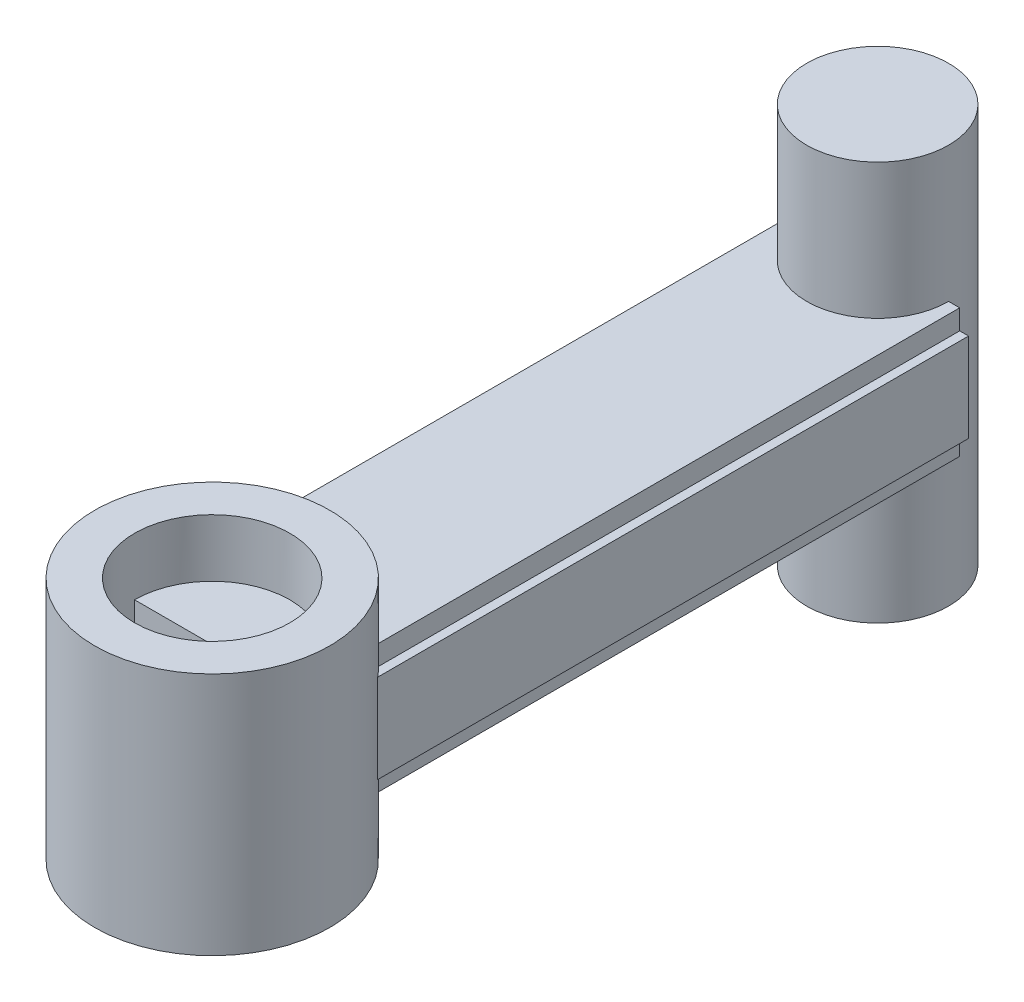
ISO-10303-21;
HEADER;
FILE_DESCRIPTION(('STEP AP214'),'2;1');
FILE_NAME('part.step','',(''),(''),'','','');
FILE_SCHEMA(('AUTOMOTIVE_DESIGN { 1 0 10303 214 1 1 1 1 }'));
ENDSEC;
DATA;
#1=APPLICATION_CONTEXT('core data for automotive mechanical design processes');
#2=APPLICATION_PROTOCOL_DEFINITION('international standard','automotive_design',2000,#1);
#3=PRODUCT_CONTEXT('',#1,'mechanical');
#4=PRODUCT('Part','Part','',(#3));
#5=PRODUCT_RELATED_PRODUCT_CATEGORY('part','',(#4));
#6=PRODUCT_DEFINITION_FORMATION('','',#4);
#7=PRODUCT_DEFINITION_CONTEXT('part definition',#1,'design');
#8=PRODUCT_DEFINITION('design','',#6,#7);
#9=PRODUCT_DEFINITION_SHAPE('','',#8);
#10=(LENGTH_UNIT() NAMED_UNIT(*) SI_UNIT(.MILLI.,.METRE.));
#11=(NAMED_UNIT(*) PLANE_ANGLE_UNIT() SI_UNIT($,.RADIAN.));
#12=(NAMED_UNIT(*) SI_UNIT($,.STERADIAN.) SOLID_ANGLE_UNIT());
#13=UNCERTAINTY_MEASURE_WITH_UNIT(LENGTH_MEASURE(1.E-05),#10,'distance_accuracy_value','');
#14=(GEOMETRIC_REPRESENTATION_CONTEXT(3) GLOBAL_UNCERTAINTY_ASSIGNED_CONTEXT((#13)) GLOBAL_UNIT_ASSIGNED_CONTEXT((#10,
#11,#12)) REPRESENTATION_CONTEXT('',''));
#15=CARTESIAN_POINT('',(0.,0.,0.));
#16=DIRECTION('',(0.,0.,1.));
#17=DIRECTION('',(1.,0.,0.));
#18=AXIS2_PLACEMENT_3D('',#15,#16,#17);
#19=CARTESIAN_POINT('',(-37.,-29.,300.));
#20=DIRECTION('',(1.,0.,0.));
#21=DIRECTION('',(0.,0.,-1.));
#22=AXIS2_PLACEMENT_3D('',#19,#20,#21);
#23=PLANE('',#22);
#24=DIRECTION('',(0.,0.,-1.));
#25=VECTOR('',#24,1.);
#26=CARTESIAN_POINT('',(-37.,20.,300.));
#27=LINE('',#26,#25);
#28=CARTESIAN_POINT('',(-37.,20.,262.052668077979));
#29=VERTEX_POINT('',#28);
#30=CARTESIAN_POINT('',(-37.,20.,0.));
#31=VERTEX_POINT('',#30);
#32=EDGE_CURVE('E377',#29,#31,#27,.T.);
#33=ORIENTED_EDGE('',*,*,#32,.F.);
#34=DIRECTION('',(0.,1.,0.));
#35=VECTOR('',#34,1.);
#36=CARTESIAN_POINT('',(-37.,-55.,262.052668077979));
#37=LINE('',#36,#35);
#38=CARTESIAN_POINT('',(-37.,29.,262.052668077979));
#39=VERTEX_POINT('',#38);
#40=EDGE_CURVE('E171',#29,#39,#37,.T.);
#41=ORIENTED_EDGE('',*,*,#40,.T.);
#42=DIRECTION('',(0.,0.,-1.));
#43=VECTOR('',#42,1.);
#44=CARTESIAN_POINT('',(-37.,29.,300.));
#45=LINE('',#44,#43);
#46=CARTESIAN_POINT('',(-37.,29.,0.));
#47=VERTEX_POINT('',#46);
#48=EDGE_CURVE('E231',#39,#47,#45,.T.);
#49=ORIENTED_EDGE('',*,*,#48,.T.);
#50=DIRECTION('',(0.,-1.,0.));
#51=VECTOR('',#50,1.);
#52=CARTESIAN_POINT('',(-37.,-29.,0.));
#53=LINE('',#52,#51);
#54=EDGE_CURVE('E223',#47,#31,#53,.T.);
#55=ORIENTED_EDGE('',*,*,#54,.T.);
#56=EDGE_LOOP('',(#33,#41,#49,#55));
#57=FACE_BOUND('',#56,.T.);
#58=ADVANCED_FACE('F41',(#57),#23,.F.);
#59=CARTESIAN_POINT('',(37.,-29.,300.));
#60=DIRECTION('',(-1.,0.,0.));
#61=DIRECTION('',(0.,0.,1.));
#62=AXIS2_PLACEMENT_3D('',#59,#60,#61);
#63=PLANE('',#62);
#64=DIRECTION('',(0.,0.,-1.));
#65=VECTOR('',#64,1.);
#66=CARTESIAN_POINT('',(37.,-20.,300.));
#67=LINE('',#66,#65);
#68=CARTESIAN_POINT('',(37.,-20.,262.052668077979));
#69=VERTEX_POINT('',#68);
#70=CARTESIAN_POINT('',(37.,-20.,0.));
#71=VERTEX_POINT('',#70);
#72=EDGE_CURVE('E202',#69,#71,#67,.T.);
#73=ORIENTED_EDGE('',*,*,#72,.F.);
#74=DIRECTION('',(0.,1.,0.));
#75=VECTOR('',#74,1.);
#76=CARTESIAN_POINT('',(37.,-55.,262.052668077979));
#77=LINE('',#76,#75);
#78=CARTESIAN_POINT('',(37.,-29.,262.052668077979));
#79=VERTEX_POINT('',#78);
#80=EDGE_CURVE('E363',#69,#79,#77,.F.);
#81=ORIENTED_EDGE('',*,*,#80,.T.);
#82=DIRECTION('',(0.,0.,-1.));
#83=VECTOR('',#82,1.);
#84=CARTESIAN_POINT('',(37.,-29.,300.));
#85=LINE('',#84,#83);
#86=CARTESIAN_POINT('',(37.,-29.,0.));
#87=VERTEX_POINT('',#86);
#88=EDGE_CURVE('E214',#79,#87,#85,.T.);
#89=ORIENTED_EDGE('',*,*,#88,.T.);
#90=DIRECTION('',(0.,1.,0.));
#91=VECTOR('',#90,1.);
#92=CARTESIAN_POINT('',(37.,-29.,0.));
#93=LINE('',#92,#91);
#94=EDGE_CURVE('E215',#87,#71,#93,.T.);
#95=ORIENTED_EDGE('',*,*,#94,.T.);
#96=EDGE_LOOP('',(#73,#81,#89,#95));
#97=FACE_BOUND('',#96,.T.);
#98=ADVANCED_FACE('F273',(#97),#63,.F.);
#99=CARTESIAN_POINT('',(0.,-90.,0.));
#100=DIRECTION('',(0.,1.,0.));
#101=DIRECTION('',(0.,0.,1.));
#102=AXIS2_PLACEMENT_3D('',#99,#100,#101);
#103=CYLINDRICAL_SURFACE('',#102,32.);
#104=DIRECTION('',(0.,1.,0.));
#105=VECTOR('',#104,1.);
#106=CARTESIAN_POINT('',(-32.,-90.,0.));
#107=LINE('',#106,#105);
#108=CARTESIAN_POINT('',(-32.,29.,0.));
#109=VERTEX_POINT('',#108);
#110=CARTESIAN_POINT('',(-32.,-29.,0.));
#111=VERTEX_POINT('',#110);
#112=EDGE_CURVE('E162',#109,#111,#107,.F.);
#113=ORIENTED_EDGE('',*,*,#112,.F.);
#114=CARTESIAN_POINT('',(0.,29.,0.));
#115=DIRECTION('',(0.,-1.,0.));
#116=DIRECTION('',(0.,0.,-1.));
#117=AXIS2_PLACEMENT_3D('',#114,#115,#116);
#118=CIRCLE('',#117,32.);
#119=CARTESIAN_POINT('',(32.,29.,0.));
#120=VERTEX_POINT('',#119);
#121=EDGE_CURVE('E246',#109,#120,#118,.F.);
#122=ORIENTED_EDGE('',*,*,#121,.T.);
#123=DIRECTION('',(0.,1.,0.));
#124=VECTOR('',#123,1.);
#125=CARTESIAN_POINT('',(32.,-90.,0.));
#126=LINE('',#125,#124);
#127=CARTESIAN_POINT('',(32.,-29.,0.));
#128=VERTEX_POINT('',#127);
#129=EDGE_CURVE('E241',#128,#120,#126,.T.);
#130=ORIENTED_EDGE('',*,*,#129,.F.);
#131=CARTESIAN_POINT('',(0.,-29.,0.));
#132=DIRECTION('',(0.,1.,0.));
#133=DIRECTION('',(0.,0.,1.));
#134=AXIS2_PLACEMENT_3D('',#131,#132,#133);
#135=CIRCLE('',#134,32.);
#136=EDGE_CURVE('E244',#128,#111,#135,.F.);
#137=ORIENTED_EDGE('',*,*,#136,.T.);
#138=EDGE_LOOP('',(#113,#122,#130,#137));
#139=FACE_BOUND('',#138,.T.);
#140=CARTESIAN_POINT('',(0.,-90.,0.));
#141=DIRECTION('',(0.,1.,0.));
#142=DIRECTION('',(0.,0.,1.));
#143=AXIS2_PLACEMENT_3D('',#140,#141,#142);
#144=CIRCLE('',#143,32.);
#145=CARTESIAN_POINT('',(0.,-90.,32.));
#146=VERTEX_POINT('',#145);
#147=EDGE_CURVE('E238',#146,#146,#144,.T.);
#148=ORIENTED_EDGE('',*,*,#147,.T.);
#149=EDGE_LOOP('',(#148));
#150=FACE_BOUND('',#149,.T.);
#151=CARTESIAN_POINT('',(0.,90.,0.));
#152=DIRECTION('',(0.,1.,0.));
#153=DIRECTION('',(0.,0.,1.));
#154=AXIS2_PLACEMENT_3D('',#151,#152,#153);
#155=CIRCLE('',#154,32.);
#156=CARTESIAN_POINT('',(0.,90.,32.));
#157=VERTEX_POINT('',#156);
#158=EDGE_CURVE('E235',#157,#157,#155,.T.);
#159=ORIENTED_EDGE('',*,*,#158,.F.);
#160=EDGE_LOOP('',(#159));
#161=FACE_BOUND('',#160,.T.);
#162=ADVANCED_FACE('F43',(#139,#150,#161),#103,.T.);
#163=CARTESIAN_POINT('',(0.,-90.,0.));
#164=DIRECTION('',(0.,1.,0.));
#165=DIRECTION('',(0.,0.,1.));
#166=AXIS2_PLACEMENT_3D('',#163,#164,#165);
#167=PLANE('',#166);
#168=ORIENTED_EDGE('',*,*,#147,.F.);
#169=EDGE_LOOP('',(#168));
#170=FACE_BOUND('',#169,.T.);
#171=ADVANCED_FACE('F407',(#170),#167,.F.);
#172=CARTESIAN_POINT('',(0.,90.,0.));
#173=DIRECTION('',(0.,1.,0.));
#174=DIRECTION('',(0.,0.,1.));
#175=AXIS2_PLACEMENT_3D('',#172,#173,#174);
#176=PLANE('',#175);
#177=ORIENTED_EDGE('',*,*,#158,.T.);
#178=EDGE_LOOP('',(#177));
#179=FACE_BOUND('',#178,.T.);
#180=ADVANCED_FACE('F412',(#179),#176,.T.);
#181=CARTESIAN_POINT('',(0.,0.,0.));
#182=DIRECTION('',(0.,0.,-1.));
#183=DIRECTION('',(-1.,0.,0.));
#184=AXIS2_PLACEMENT_3D('',#181,#182,#183);
#185=PLANE('',#184);
#186=DIRECTION('',(-1.,0.,0.));
#187=VECTOR('',#186,1.);
#188=CARTESIAN_POINT('',(-37.,29.,0.));
#189=LINE('',#188,#187);
#190=EDGE_CURVE('E218',#109,#47,#189,.T.);
#191=ORIENTED_EDGE('',*,*,#190,.F.);
#192=ORIENTED_EDGE('',*,*,#112,.T.);
#193=DIRECTION('',(1.,0.,0.));
#194=VECTOR('',#193,1.);
#195=CARTESIAN_POINT('',(-37.,-29.,0.));
#196=LINE('',#195,#194);
#197=CARTESIAN_POINT('',(-37.,-29.,0.));
#198=VERTEX_POINT('',#197);
#199=EDGE_CURVE('E212',#198,#111,#196,.T.);
#200=ORIENTED_EDGE('',*,*,#199,.F.);
#201=CARTESIAN_POINT('',(-37.,-20.,0.));
#202=VERTEX_POINT('',#201);
#203=EDGE_CURVE('E222',#202,#198,#53,.T.);
#204=ORIENTED_EDGE('',*,*,#203,.F.);
#205=DIRECTION('',(1.,0.,0.));
#206=VECTOR('',#205,1.);
#207=CARTESIAN_POINT('',(-41.,-20.,0.));
#208=LINE('',#207,#206);
#209=CARTESIAN_POINT('',(-41.,-20.,0.));
#210=VERTEX_POINT('',#209);
#211=EDGE_CURVE('E176',#210,#202,#208,.T.);
#212=ORIENTED_EDGE('',*,*,#211,.F.);
#213=DIRECTION('',(0.,-1.,0.));
#214=VECTOR('',#213,1.);
#215=CARTESIAN_POINT('',(-41.,-20.,0.));
#216=LINE('',#215,#214);
#217=CARTESIAN_POINT('',(-41.,20.,0.));
#218=VERTEX_POINT('',#217);
#219=EDGE_CURVE('E180',#218,#210,#216,.T.);
#220=ORIENTED_EDGE('',*,*,#219,.F.);
#221=DIRECTION('',(-1.,0.,0.));
#222=VECTOR('',#221,1.);
#223=CARTESIAN_POINT('',(-41.,20.,0.));
#224=LINE('',#223,#222);
#225=EDGE_CURVE('E188',#31,#218,#224,.T.);
#226=ORIENTED_EDGE('',*,*,#225,.F.);
#227=ORIENTED_EDGE('',*,*,#54,.F.);
#228=EDGE_LOOP('',(#191,#192,#200,#204,#212,#220,#226,#227));
#229=FACE_BOUND('',#228,.T.);
#230=ADVANCED_FACE('F293',(#229),#185,.T.);
#231=DIRECTION('',(0.,0.,-1.));
#232=VECTOR('',#231,1.);
#233=CARTESIAN_POINT('',(37.,29.,300.));
#234=LINE('',#233,#232);
#235=CARTESIAN_POINT('',(37.,29.,262.052668077979));
#236=VERTEX_POINT('',#235);
#237=CARTESIAN_POINT('',(37.,29.,0.));
#238=VERTEX_POINT('',#237);
#239=EDGE_CURVE('E233',#236,#238,#234,.T.);
#240=ORIENTED_EDGE('',*,*,#239,.F.);
#241=DIRECTION('',(0.,1.,0.));
#242=VECTOR('',#241,1.);
#243=CARTESIAN_POINT('',(37.,-55.,262.052668077979));
#244=LINE('',#243,#242);
#245=CARTESIAN_POINT('',(37.,20.,262.052668077979));
#246=VERTEX_POINT('',#245);
#247=EDGE_CURVE('E360',#236,#246,#244,.F.);
#248=ORIENTED_EDGE('',*,*,#247,.T.);
#249=DIRECTION('',(0.,0.,-1.));
#250=VECTOR('',#249,1.);
#251=CARTESIAN_POINT('',(37.,20.,300.));
#252=LINE('',#251,#250);
#253=CARTESIAN_POINT('',(37.,20.,0.));
#254=VERTEX_POINT('',#253);
#255=EDGE_CURVE('E204',#246,#254,#252,.T.);
#256=ORIENTED_EDGE('',*,*,#255,.T.);
#257=EDGE_CURVE('E208',#254,#238,#93,.T.);
#258=ORIENTED_EDGE('',*,*,#257,.T.);
#259=EDGE_LOOP('',(#240,#248,#256,#258));
#260=FACE_BOUND('',#259,.T.);
#261=ADVANCED_FACE('F270',(#260),#63,.F.);
#262=CARTESIAN_POINT('',(-37.,29.,300.));
#263=DIRECTION('',(0.,-1.,0.));
#264=DIRECTION('',(0.,0.,-1.));
#265=AXIS2_PLACEMENT_3D('',#262,#263,#264);
#266=PLANE('',#265);
#267=ORIENTED_EDGE('',*,*,#48,.F.);
#268=CARTESIAN_POINT('',(0.,29.,300.));
#269=DIRECTION('',(0.,-1.,0.));
#270=DIRECTION('',(0.,0.,-1.));
#271=AXIS2_PLACEMENT_3D('',#268,#269,#270);
#272=CIRCLE('',#271,53.);
#273=EDGE_CURVE('E357',#39,#236,#272,.T.);
#274=ORIENTED_EDGE('',*,*,#273,.T.);
#275=ORIENTED_EDGE('',*,*,#239,.T.);
#276=EDGE_CURVE('E219',#238,#120,#189,.T.);
#277=ORIENTED_EDGE('',*,*,#276,.T.);
#278=ORIENTED_EDGE('',*,*,#121,.F.);
#279=ORIENTED_EDGE('',*,*,#190,.T.);
#280=EDGE_LOOP('',(#267,#274,#275,#277,#278,#279));
#281=FACE_BOUND('',#280,.T.);
#282=ADVANCED_FACE('F260',(#281),#266,.F.);
#283=DIRECTION('',(0.,0.,-1.));
#284=VECTOR('',#283,1.);
#285=CARTESIAN_POINT('',(-37.,-29.,300.));
#286=LINE('',#285,#284);
#287=CARTESIAN_POINT('',(-37.,-29.,262.052668077979));
#288=VERTEX_POINT('',#287);
#289=EDGE_CURVE('E170',#288,#198,#286,.T.);
#290=ORIENTED_EDGE('',*,*,#289,.F.);
#291=DIRECTION('',(0.,1.,0.));
#292=VECTOR('',#291,1.);
#293=CARTESIAN_POINT('',(-37.,-55.,262.052668077979));
#294=LINE('',#293,#292);
#295=CARTESIAN_POINT('',(-37.,-20.,262.052668077979));
#296=VERTEX_POINT('',#295);
#297=EDGE_CURVE('E155',#288,#296,#294,.T.);
#298=ORIENTED_EDGE('',*,*,#297,.T.);
#299=DIRECTION('',(0.,0.,-1.));
#300=VECTOR('',#299,1.);
#301=CARTESIAN_POINT('',(-37.,-20.,300.));
#302=LINE('',#301,#300);
#303=EDGE_CURVE('E168',#296,#202,#302,.T.);
#304=ORIENTED_EDGE('',*,*,#303,.T.);
#305=ORIENTED_EDGE('',*,*,#203,.T.);
#306=EDGE_LOOP('',(#290,#298,#304,#305));
#307=FACE_BOUND('',#306,.T.);
#308=ADVANCED_FACE('F166',(#307),#23,.F.);
#309=CARTESIAN_POINT('',(-37.,-29.,300.));
#310=DIRECTION('',(0.,1.,0.));
#311=DIRECTION('',(0.,0.,1.));
#312=AXIS2_PLACEMENT_3D('',#309,#310,#311);
#313=PLANE('',#312);
#314=ORIENTED_EDGE('',*,*,#88,.F.);
#315=CARTESIAN_POINT('',(0.,-29.,300.));
#316=DIRECTION('',(0.,1.,0.));
#317=DIRECTION('',(0.,0.,1.));
#318=AXIS2_PLACEMENT_3D('',#315,#316,#317);
#319=CIRCLE('',#318,53.);
#320=EDGE_CURVE('E355',#79,#288,#319,.T.);
#321=ORIENTED_EDGE('',*,*,#320,.T.);
#322=ORIENTED_EDGE('',*,*,#289,.T.);
#323=ORIENTED_EDGE('',*,*,#199,.T.);
#324=ORIENTED_EDGE('',*,*,#136,.F.);
#325=EDGE_CURVE('E226',#128,#87,#196,.T.);
#326=ORIENTED_EDGE('',*,*,#325,.T.);
#327=EDGE_LOOP('',(#314,#321,#322,#323,#324,#326));
#328=FACE_BOUND('',#327,.T.);
#329=ADVANCED_FACE('F266',(#328),#313,.F.);
#330=ORIENTED_EDGE('',*,*,#325,.F.);
#331=ORIENTED_EDGE('',*,*,#129,.T.);
#332=ORIENTED_EDGE('',*,*,#276,.F.);
#333=ORIENTED_EDGE('',*,*,#257,.F.);
#334=DIRECTION('',(-1.,0.,0.));
#335=VECTOR('',#334,1.);
#336=CARTESIAN_POINT('',(37.,20.,0.));
#337=LINE('',#336,#335);
#338=CARTESIAN_POINT('',(41.,20.,0.));
#339=VERTEX_POINT('',#338);
#340=EDGE_CURVE('E194',#339,#254,#337,.T.);
#341=ORIENTED_EDGE('',*,*,#340,.F.);
#342=DIRECTION('',(0.,1.,0.));
#343=VECTOR('',#342,1.);
#344=CARTESIAN_POINT('',(41.,-20.,0.));
#345=LINE('',#344,#343);
#346=CARTESIAN_POINT('',(41.,-20.,0.));
#347=VERTEX_POINT('',#346);
#348=EDGE_CURVE('E191',#347,#339,#345,.T.);
#349=ORIENTED_EDGE('',*,*,#348,.F.);
#350=DIRECTION('',(1.,0.,0.));
#351=VECTOR('',#350,1.);
#352=CARTESIAN_POINT('',(37.,-20.,0.));
#353=LINE('',#352,#351);
#354=EDGE_CURVE('E197',#71,#347,#353,.T.);
#355=ORIENTED_EDGE('',*,*,#354,.F.);
#356=ORIENTED_EDGE('',*,*,#94,.F.);
#357=EDGE_LOOP('',(#330,#331,#332,#333,#341,#349,#355,#356));
#358=FACE_BOUND('',#357,.T.);
#359=ADVANCED_FACE('F285',(#358),#185,.T.);
#360=CARTESIAN_POINT('',(41.,-20.,300.));
#361=DIRECTION('',(-1.,0.,0.));
#362=DIRECTION('',(0.,0.,1.));
#363=AXIS2_PLACEMENT_3D('',#360,#361,#362);
#364=PLANE('',#363);
#365=DIRECTION('',(0.,0.,-1.));
#366=VECTOR('',#365,1.);
#367=CARTESIAN_POINT('',(41.,20.,300.));
#368=LINE('',#367,#366);
#369=CARTESIAN_POINT('',(41.,20.,266.414288752507));
#370=VERTEX_POINT('',#369);
#371=EDGE_CURVE('E206',#370,#339,#368,.T.);
#372=ORIENTED_EDGE('',*,*,#371,.F.);
#373=DIRECTION('',(0.,1.,0.));
#374=VECTOR('',#373,1.);
#375=CARTESIAN_POINT('',(41.,-55.,266.414288752507));
#376=LINE('',#375,#374);
#377=CARTESIAN_POINT('',(41.,-20.,266.414288752507));
#378=VERTEX_POINT('',#377);
#379=EDGE_CURVE('E372',#370,#378,#376,.F.);
#380=ORIENTED_EDGE('',*,*,#379,.T.);
#381=DIRECTION('',(0.,0.,-1.));
#382=VECTOR('',#381,1.);
#383=CARTESIAN_POINT('',(41.,-20.,300.));
#384=LINE('',#383,#382);
#385=EDGE_CURVE('E200',#378,#347,#384,.T.);
#386=ORIENTED_EDGE('',*,*,#385,.T.);
#387=ORIENTED_EDGE('',*,*,#348,.T.);
#388=EDGE_LOOP('',(#372,#380,#386,#387));
#389=FACE_BOUND('',#388,.T.);
#390=ADVANCED_FACE('F290',(#389),#364,.F.);
#391=CARTESIAN_POINT('',(37.,20.,300.));
#392=DIRECTION('',(0.,-1.,0.));
#393=DIRECTION('',(0.,0.,-1.));
#394=AXIS2_PLACEMENT_3D('',#391,#392,#393);
#395=PLANE('',#394);
#396=ORIENTED_EDGE('',*,*,#255,.F.);
#397=CARTESIAN_POINT('',(0.,20.,300.));
#398=DIRECTION('',(0.,-1.,0.));
#399=DIRECTION('',(0.,0.,-1.));
#400=AXIS2_PLACEMENT_3D('',#397,#398,#399);
#401=CIRCLE('',#400,53.);
#402=EDGE_CURVE('E369',#246,#370,#401,.T.);
#403=ORIENTED_EDGE('',*,*,#402,.T.);
#404=ORIENTED_EDGE('',*,*,#371,.T.);
#405=ORIENTED_EDGE('',*,*,#340,.T.);
#406=EDGE_LOOP('',(#396,#403,#404,#405));
#407=FACE_BOUND('',#406,.T.);
#408=ADVANCED_FACE('F300',(#407),#395,.F.);
#409=CARTESIAN_POINT('',(37.,-20.,300.));
#410=DIRECTION('',(0.,1.,0.));
#411=DIRECTION('',(0.,0.,1.));
#412=AXIS2_PLACEMENT_3D('',#409,#410,#411);
#413=PLANE('',#412);
#414=ORIENTED_EDGE('',*,*,#385,.F.);
#415=CARTESIAN_POINT('',(0.,-20.,300.));
#416=DIRECTION('',(0.,1.,0.));
#417=DIRECTION('',(0.,0.,1.));
#418=AXIS2_PLACEMENT_3D('',#415,#416,#417);
#419=CIRCLE('',#418,53.);
#420=EDGE_CURVE('E366',#378,#69,#419,.T.);
#421=ORIENTED_EDGE('',*,*,#420,.T.);
#422=ORIENTED_EDGE('',*,*,#72,.T.);
#423=ORIENTED_EDGE('',*,*,#354,.T.);
#424=EDGE_LOOP('',(#414,#421,#422,#423));
#425=FACE_BOUND('',#424,.T.);
#426=ADVANCED_FACE('F304',(#425),#413,.F.);
#427=CARTESIAN_POINT('',(-41.,20.,300.));
#428=DIRECTION('',(0.,-1.,0.));
#429=DIRECTION('',(0.,0.,-1.));
#430=AXIS2_PLACEMENT_3D('',#427,#428,#429);
#431=PLANE('',#430);
#432=DIRECTION('',(0.,0.,-1.));
#433=VECTOR('',#432,1.);
#434=CARTESIAN_POINT('',(-41.,20.,300.));
#435=LINE('',#434,#433);
#436=CARTESIAN_POINT('',(-41.,20.,266.414288752507));
#437=VERTEX_POINT('',#436);
#438=EDGE_CURVE('E182',#437,#218,#435,.T.);
#439=ORIENTED_EDGE('',*,*,#438,.F.);
#440=CARTESIAN_POINT('',(0.,20.,300.));
#441=DIRECTION('',(0.,-1.,0.));
#442=DIRECTION('',(0.,0.,-1.));
#443=AXIS2_PLACEMENT_3D('',#440,#441,#442);
#444=CIRCLE('',#443,53.);
#445=EDGE_CURVE('E172',#437,#29,#444,.T.);
#446=ORIENTED_EDGE('',*,*,#445,.T.);
#447=ORIENTED_EDGE('',*,*,#32,.T.);
#448=ORIENTED_EDGE('',*,*,#225,.T.);
#449=EDGE_LOOP('',(#439,#446,#447,#448));
#450=FACE_BOUND('',#449,.T.);
#451=ADVANCED_FACE('F308',(#450),#431,.F.);
#452=CARTESIAN_POINT('',(-41.,-20.,300.));
#453=DIRECTION('',(1.,0.,0.));
#454=DIRECTION('',(0.,0.,-1.));
#455=AXIS2_PLACEMENT_3D('',#452,#453,#454);
#456=PLANE('',#455);
#457=DIRECTION('',(0.,0.,-1.));
#458=VECTOR('',#457,1.);
#459=CARTESIAN_POINT('',(-41.,-20.,300.));
#460=LINE('',#459,#458);
#461=CARTESIAN_POINT('',(-41.,-20.,266.414288752507));
#462=VERTEX_POINT('',#461);
#463=EDGE_CURVE('E178',#462,#210,#460,.T.);
#464=ORIENTED_EDGE('',*,*,#463,.F.);
#465=DIRECTION('',(0.,1.,0.));
#466=VECTOR('',#465,1.);
#467=CARTESIAN_POINT('',(-41.,-55.,266.414288752507));
#468=LINE('',#467,#466);
#469=EDGE_CURVE('E158',#462,#437,#468,.T.);
#470=ORIENTED_EDGE('',*,*,#469,.T.);
#471=ORIENTED_EDGE('',*,*,#438,.T.);
#472=ORIENTED_EDGE('',*,*,#219,.T.);
#473=EDGE_LOOP('',(#464,#470,#471,#472));
#474=FACE_BOUND('',#473,.T.);
#475=ADVANCED_FACE('F312',(#474),#456,.F.);
#476=CARTESIAN_POINT('',(-41.,-20.,300.));
#477=DIRECTION('',(0.,1.,0.));
#478=DIRECTION('',(0.,0.,1.));
#479=AXIS2_PLACEMENT_3D('',#476,#477,#478);
#480=PLANE('',#479);
#481=ORIENTED_EDGE('',*,*,#303,.F.);
#482=CARTESIAN_POINT('',(0.,-20.,300.));
#483=DIRECTION('',(0.,1.,0.));
#484=DIRECTION('',(0.,0.,1.));
#485=AXIS2_PLACEMENT_3D('',#482,#483,#484);
#486=CIRCLE('',#485,53.);
#487=EDGE_CURVE('E152',#296,#462,#486,.T.);
#488=ORIENTED_EDGE('',*,*,#487,.T.);
#489=ORIENTED_EDGE('',*,*,#463,.T.);
#490=ORIENTED_EDGE('',*,*,#211,.T.);
#491=EDGE_LOOP('',(#481,#488,#489,#490));
#492=FACE_BOUND('',#491,.T.);
#493=ADVANCED_FACE('F174',(#492),#480,.F.);
#494=CARTESIAN_POINT('',(0.,-55.,300.));
#495=DIRECTION('',(0.,1.,0.));
#496=DIRECTION('',(0.,0.,1.));
#497=AXIS2_PLACEMENT_3D('',#494,#495,#496);
#498=CYLINDRICAL_SURFACE('',#497,35.);
#499=CARTESIAN_POINT('',(0.,-55.,300.));
#500=DIRECTION('',(0.,1.,0.));
#501=DIRECTION('',(0.,0.,1.));
#502=AXIS2_PLACEMENT_3D('',#499,#500,#501);
#503=CIRCLE('',#502,35.);
#504=CARTESIAN_POINT('',(0.,-55.,335.));
#505=VERTEX_POINT('',#504);
#506=EDGE_CURVE('E342',#505,#505,#503,.T.);
#507=ORIENTED_EDGE('',*,*,#506,.F.);
#508=EDGE_LOOP('',(#507));
#509=FACE_BOUND('',#508,.T.);
#510=CARTESIAN_POINT('',(0.,55.,300.));
#511=DIRECTION('',(0.,1.,0.));
#512=DIRECTION('',(0.,0.,1.));
#513=AXIS2_PLACEMENT_3D('',#510,#511,#512);
#514=CIRCLE('',#513,35.);
#515=CARTESIAN_POINT('',(0.,55.,335.));
#516=VERTEX_POINT('',#515);
#517=EDGE_CURVE('E339',#516,#516,#514,.T.);
#518=ORIENTED_EDGE('',*,*,#517,.T.);
#519=EDGE_LOOP('',(#518));
#520=FACE_BOUND('',#519,.T.);
#521=CARTESIAN_POINT('',(0.,-29.,300.));
#522=DIRECTION('',(0.,1.,0.));
#523=DIRECTION('',(0.,0.,1.));
#524=AXIS2_PLACEMENT_3D('',#521,#522,#523);
#525=CIRCLE('',#524,35.);
#526=CARTESIAN_POINT('',(35.,-29.,300.));
#527=VERTEX_POINT('',#526);
#528=CARTESIAN_POINT('',(-35.,-29.,300.));
#529=VERTEX_POINT('',#528);
#530=EDGE_CURVE('E254',#527,#529,#525,.T.);
#531=ORIENTED_EDGE('',*,*,#530,.T.);
#532=DIRECTION('',(0.,1.,0.));
#533=VECTOR('',#532,1.);
#534=CARTESIAN_POINT('',(-35.,-55.,300.));
#535=LINE('',#534,#533);
#536=CARTESIAN_POINT('',(-35.,29.,300.));
#537=VERTEX_POINT('',#536);
#538=EDGE_CURVE('E11',#529,#537,#535,.T.);
#539=ORIENTED_EDGE('',*,*,#538,.T.);
#540=CARTESIAN_POINT('',(0.,29.,300.));
#541=DIRECTION('',(0.,-1.,0.));
#542=DIRECTION('',(0.,0.,-1.));
#543=AXIS2_PLACEMENT_3D('',#540,#541,#542);
#544=CIRCLE('',#543,35.);
#545=CARTESIAN_POINT('',(35.,29.,300.));
#546=VERTEX_POINT('',#545);
#547=EDGE_CURVE('E61',#537,#546,#544,.T.);
#548=ORIENTED_EDGE('',*,*,#547,.T.);
#549=DIRECTION('',(0.,1.,0.));
#550=VECTOR('',#549,1.);
#551=CARTESIAN_POINT('',(35.,-55.,300.));
#552=LINE('',#551,#550);
#553=EDGE_CURVE('E49',#546,#527,#552,.F.);
#554=ORIENTED_EDGE('',*,*,#553,.T.);
#555=EDGE_LOOP('',(#531,#539,#548,#554));
#556=FACE_BOUND('',#555,.T.);
#557=ADVANCED_FACE('F252',(#509,#520,#556),#498,.F.);
#558=CARTESIAN_POINT('',(0.,-55.,300.));
#559=DIRECTION('',(0.,1.,0.));
#560=DIRECTION('',(0.,0.,1.));
#561=AXIS2_PLACEMENT_3D('',#558,#559,#560);
#562=CYLINDRICAL_SURFACE('',#561,53.);
#563=CARTESIAN_POINT('',(0.,55.,300.));
#564=DIRECTION('',(0.,1.,0.));
#565=DIRECTION('',(0.,0.,1.));
#566=AXIS2_PLACEMENT_3D('',#563,#564,#565);
#567=CIRCLE('',#566,53.);
#568=CARTESIAN_POINT('',(0.,55.,353.));
#569=VERTEX_POINT('',#568);
#570=EDGE_CURVE('E336',#569,#569,#567,.T.);
#571=ORIENTED_EDGE('',*,*,#570,.F.);
#572=EDGE_LOOP('',(#571));
#573=FACE_BOUND('',#572,.T.);
#574=CARTESIAN_POINT('',(0.,-55.,300.));
#575=DIRECTION('',(0.,1.,0.));
#576=DIRECTION('',(0.,0.,1.));
#577=AXIS2_PLACEMENT_3D('',#574,#575,#576);
#578=CIRCLE('',#577,53.);
#579=CARTESIAN_POINT('',(0.,-55.,353.));
#580=VERTEX_POINT('',#579);
#581=EDGE_CURVE('E347',#580,#580,#578,.T.);
#582=ORIENTED_EDGE('',*,*,#581,.T.);
#583=EDGE_LOOP('',(#582));
#584=FACE_BOUND('',#583,.T.);
#585=ORIENTED_EDGE('',*,*,#379,.F.);
#586=ORIENTED_EDGE('',*,*,#402,.F.);
#587=ORIENTED_EDGE('',*,*,#247,.F.);
#588=ORIENTED_EDGE('',*,*,#273,.F.);
#589=ORIENTED_EDGE('',*,*,#40,.F.);
#590=ORIENTED_EDGE('',*,*,#445,.F.);
#591=ORIENTED_EDGE('',*,*,#469,.F.);
#592=ORIENTED_EDGE('',*,*,#487,.F.);
#593=ORIENTED_EDGE('',*,*,#297,.F.);
#594=ORIENTED_EDGE('',*,*,#320,.F.);
#595=ORIENTED_EDGE('',*,*,#80,.F.);
#596=ORIENTED_EDGE('',*,*,#420,.F.);
#597=EDGE_LOOP('',(#585,#586,#587,#588,#589,#590,#591,#592,#593,#594,#595,#596));
#598=FACE_BOUND('',#597,.T.);
#599=ADVANCED_FACE('F154',(#573,#584,#598),#562,.T.);
#600=CARTESIAN_POINT('',(0.,-55.,300.));
#601=DIRECTION('',(0.,1.,0.));
#602=DIRECTION('',(0.,0.,1.));
#603=AXIS2_PLACEMENT_3D('',#600,#601,#602);
#604=PLANE('',#603);
#605=ORIENTED_EDGE('',*,*,#506,.T.);
#606=EDGE_LOOP('',(#605));
#607=FACE_BOUND('',#606,.T.);
#608=ORIENTED_EDGE('',*,*,#581,.F.);
#609=EDGE_LOOP('',(#608));
#610=FACE_BOUND('',#609,.T.);
#611=ADVANCED_FACE('F321',(#607,#610),#604,.F.);
#612=CARTESIAN_POINT('',(0.,55.,300.));
#613=DIRECTION('',(0.,1.,0.));
#614=DIRECTION('',(0.,0.,1.));
#615=AXIS2_PLACEMENT_3D('',#612,#613,#614);
#616=PLANE('',#615);
#617=ORIENTED_EDGE('',*,*,#570,.T.);
#618=EDGE_LOOP('',(#617));
#619=FACE_BOUND('',#618,.T.);
#620=ORIENTED_EDGE('',*,*,#517,.F.);
#621=EDGE_LOOP('',(#620));
#622=FACE_BOUND('',#621,.T.);
#623=ADVANCED_FACE('F298',(#619,#622),#616,.T.);
#624=CARTESIAN_POINT('',(0.,0.,300.));
#625=DIRECTION('',(0.,0.,-1.));
#626=DIRECTION('',(-1.,0.,0.));
#627=AXIS2_PLACEMENT_3D('',#624,#625,#626);
#628=PLANE('',#627);
#629=ORIENTED_EDGE('',*,*,#538,.F.);
#630=DIRECTION('',(1.,0.,0.));
#631=VECTOR('',#630,1.);
#632=CARTESIAN_POINT('',(-37.,-29.,300.));
#633=LINE('',#632,#631);
#634=EDGE_CURVE('E211',#529,#527,#633,.T.);
#635=ORIENTED_EDGE('',*,*,#634,.T.);
#636=ORIENTED_EDGE('',*,*,#553,.F.);
#637=DIRECTION('',(-1.,0.,0.));
#638=VECTOR('',#637,1.);
#639=CARTESIAN_POINT('',(-37.,29.,300.));
#640=LINE('',#639,#638);
#641=EDGE_CURVE('E209',#546,#537,#640,.T.);
#642=ORIENTED_EDGE('',*,*,#641,.T.);
#643=EDGE_LOOP('',(#629,#635,#636,#642));
#644=FACE_BOUND('',#643,.T.);
#645=ADVANCED_FACE('F255',(#644),#628,.F.);
#646=ORIENTED_EDGE('',*,*,#530,.F.);
#647=ORIENTED_EDGE('',*,*,#634,.F.);
#648=EDGE_LOOP('',(#646,#647));
#649=FACE_BOUND('',#648,.T.);
#650=ADVANCED_FACE('F258',(#649),#313,.F.);
#651=ORIENTED_EDGE('',*,*,#547,.F.);
#652=ORIENTED_EDGE('',*,*,#641,.F.);
#653=EDGE_LOOP('',(#651,#652));
#654=FACE_BOUND('',#653,.T.);
#655=ADVANCED_FACE('F256',(#654),#266,.F.);
#656=CLOSED_SHELL('',(#58,#98,#162,#171,#180,#230,#261,#282,#308,#329,#359,#390,#408,#426,#451,
#475,#493,#557,#599,#611,#623,#645,#650,#655));
#657=MANIFOLD_SOLID_BREP('B2',#656);
#658=ADVANCED_BREP_SHAPE_REPRESENTATION('',(#18,#657),#14);
#659=SHAPE_DEFINITION_REPRESENTATION(#9,#658);
ENDSEC;
END-ISO-10303-21;
